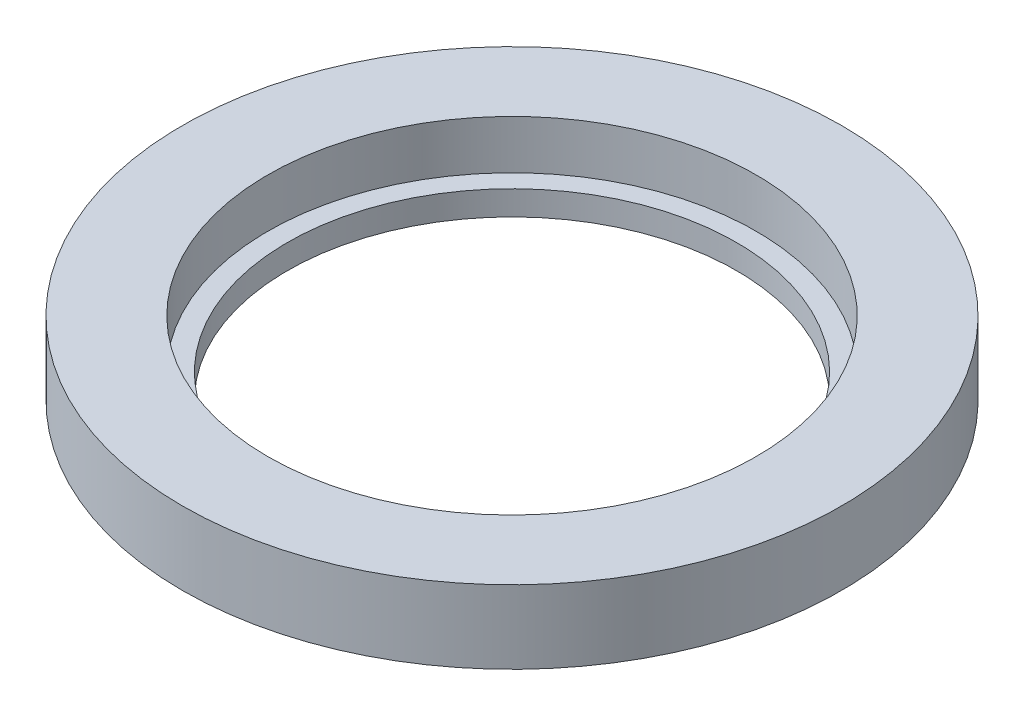
ISO-10303-21;
HEADER;
FILE_DESCRIPTION(('STEP AP214'),'2;1');
FILE_NAME('part.step','',(''),(''),'','','');
FILE_SCHEMA(('AUTOMOTIVE_DESIGN { 1 0 10303 214 1 1 1 1 }'));
ENDSEC;
DATA;
#1=APPLICATION_CONTEXT('core data for automotive mechanical design processes');
#2=APPLICATION_PROTOCOL_DEFINITION('international standard','automotive_design',2000,#1);
#3=PRODUCT_CONTEXT('',#1,'mechanical');
#4=PRODUCT('Part','Part','',(#3));
#5=PRODUCT_RELATED_PRODUCT_CATEGORY('part','',(#4));
#6=PRODUCT_DEFINITION_FORMATION('','',#4);
#7=PRODUCT_DEFINITION_CONTEXT('part definition',#1,'design');
#8=PRODUCT_DEFINITION('design','',#6,#7);
#9=PRODUCT_DEFINITION_SHAPE('','',#8);
#10=(LENGTH_UNIT() NAMED_UNIT(*) SI_UNIT(.MILLI.,.METRE.));
#11=(NAMED_UNIT(*) PLANE_ANGLE_UNIT() SI_UNIT($,.RADIAN.));
#12=(NAMED_UNIT(*) SI_UNIT($,.STERADIAN.) SOLID_ANGLE_UNIT());
#13=UNCERTAINTY_MEASURE_WITH_UNIT(LENGTH_MEASURE(1.E-05),#10,'distance_accuracy_value','');
#14=(GEOMETRIC_REPRESENTATION_CONTEXT(3) GLOBAL_UNCERTAINTY_ASSIGNED_CONTEXT((#13)) GLOBAL_UNIT_ASSIGNED_CONTEXT((#10,
#11,#12)) REPRESENTATION_CONTEXT('',''));
#15=CARTESIAN_POINT('',(0.,0.,0.));
#16=DIRECTION('',(0.,0.,1.));
#17=DIRECTION('',(1.,0.,0.));
#18=AXIS2_PLACEMENT_3D('',#15,#16,#17);
#19=CARTESIAN_POINT('',(0.,0.,0.));
#20=DIRECTION('',(0.,1.,0.));
#21=DIRECTION('',(0.,0.,1.));
#22=AXIS2_PLACEMENT_3D('',#19,#20,#21);
#23=CYLINDRICAL_SURFACE('',#22,23.);
#24=CARTESIAN_POINT('',(0.,0.,0.));
#25=DIRECTION('',(0.,1.,0.));
#26=DIRECTION('',(0.,0.,1.));
#27=AXIS2_PLACEMENT_3D('',#24,#25,#26);
#28=CIRCLE('',#27,23.);
#29=CARTESIAN_POINT('',(0.,0.,23.));
#30=VERTEX_POINT('',#29);
#31=EDGE_CURVE('E59',#30,#30,#28,.T.);
#32=ORIENTED_EDGE('',*,*,#31,.F.);
#33=EDGE_LOOP('',(#32));
#34=FACE_BOUND('',#33,.T.);
#35=CARTESIAN_POINT('',(0.,2.5,0.));
#36=DIRECTION('',(0.,1.,0.));
#37=DIRECTION('',(0.,0.,1.));
#38=AXIS2_PLACEMENT_3D('',#35,#36,#37);
#39=CIRCLE('',#38,23.);
#40=CARTESIAN_POINT('',(0.,2.5,23.));
#41=VERTEX_POINT('',#40);
#42=EDGE_CURVE('E41',#41,#41,#39,.F.);
#43=ORIENTED_EDGE('',*,*,#42,.F.);
#44=EDGE_LOOP('',(#43));
#45=FACE_BOUND('',#44,.T.);
#46=ADVANCED_FACE('F37',(#34,#45),#23,.F.);
#47=CARTESIAN_POINT('',(0.,7.5,0.));
#48=DIRECTION('',(0.,-1.,0.));
#49=DIRECTION('',(0.,0.,-1.));
#50=AXIS2_PLACEMENT_3D('',#47,#48,#49);
#51=CYLINDRICAL_SURFACE('',#50,33.75);
#52=CARTESIAN_POINT('',(0.,7.5,0.));
#53=DIRECTION('',(0.,1.,0.));
#54=DIRECTION('',(0.,0.,1.));
#55=AXIS2_PLACEMENT_3D('',#52,#53,#54);
#56=CIRCLE('',#55,33.75);
#57=CARTESIAN_POINT('',(0.,7.5,33.75));
#58=VERTEX_POINT('',#57);
#59=EDGE_CURVE('E10',#58,#58,#56,.T.);
#60=ORIENTED_EDGE('',*,*,#59,.F.);
#61=EDGE_LOOP('',(#60));
#62=FACE_BOUND('',#61,.T.);
#63=CARTESIAN_POINT('',(0.,0.,0.));
#64=DIRECTION('',(0.,1.,0.));
#65=DIRECTION('',(0.,0.,1.));
#66=AXIS2_PLACEMENT_3D('',#63,#64,#65);
#67=CIRCLE('',#66,33.75);
#68=CARTESIAN_POINT('',(0.,0.,33.75));
#69=VERTEX_POINT('',#68);
#70=EDGE_CURVE('E46',#69,#69,#67,.T.);
#71=ORIENTED_EDGE('',*,*,#70,.T.);
#72=EDGE_LOOP('',(#71));
#73=FACE_BOUND('',#72,.T.);
#74=ADVANCED_FACE('F39',(#62,#73),#51,.T.);
#75=CARTESIAN_POINT('',(0.,7.5,0.));
#76=DIRECTION('',(0.,1.,0.));
#77=DIRECTION('',(0.,0.,1.));
#78=AXIS2_PLACEMENT_3D('',#75,#76,#77);
#79=PLANE('',#78);
#80=CARTESIAN_POINT('',(0.,7.5,0.));
#81=DIRECTION('',(0.,1.,0.));
#82=DIRECTION('',(0.,0.,1.));
#83=AXIS2_PLACEMENT_3D('',#80,#81,#82);
#84=CIRCLE('',#83,25.);
#85=CARTESIAN_POINT('',(0.,7.5,25.));
#86=VERTEX_POINT('',#85);
#87=EDGE_CURVE('E89',#86,#86,#84,.T.);
#88=ORIENTED_EDGE('',*,*,#87,.F.);
#89=EDGE_LOOP('',(#88));
#90=FACE_BOUND('',#89,.T.);
#91=ORIENTED_EDGE('',*,*,#59,.T.);
#92=EDGE_LOOP('',(#91));
#93=FACE_BOUND('',#92,.T.);
#94=ADVANCED_FACE('F110',(#90,#93),#79,.T.);
#95=CARTESIAN_POINT('',(0.,0.,0.));
#96=DIRECTION('',(0.,1.,0.));
#97=DIRECTION('',(0.,0.,1.));
#98=AXIS2_PLACEMENT_3D('',#95,#96,#97);
#99=PLANE('',#98);
#100=ORIENTED_EDGE('',*,*,#31,.T.);
#101=EDGE_LOOP('',(#100));
#102=FACE_BOUND('',#101,.T.);
#103=CARTESIAN_POINT('',(-30.,0.,0.));
#104=DIRECTION('',(0.,-1.,0.));
#105=DIRECTION('',(0.,0.,-1.));
#106=AXIS2_PLACEMENT_3D('',#103,#104,#105);
#107=CIRCLE('',#106,2.6);
#108=CARTESIAN_POINT('',(-30.,0.,-2.6));
#109=VERTEX_POINT('',#108);
#110=EDGE_CURVE('E79',#109,#109,#107,.T.);
#111=ORIENTED_EDGE('',*,*,#110,.F.);
#112=EDGE_LOOP('',(#111));
#113=FACE_BOUND('',#112,.T.);
#114=CARTESIAN_POINT('',(30.,0.,0.));
#115=DIRECTION('',(0.,-1.,0.));
#116=DIRECTION('',(0.,0.,1.));
#117=AXIS2_PLACEMENT_3D('',#114,#115,#116);
#118=CIRCLE('',#117,2.6);
#119=CARTESIAN_POINT('',(30.,0.,2.6));
#120=VERTEX_POINT('',#119);
#121=EDGE_CURVE('E71',#120,#120,#118,.T.);
#122=ORIENTED_EDGE('',*,*,#121,.F.);
#123=EDGE_LOOP('',(#122));
#124=FACE_BOUND('',#123,.T.);
#125=CARTESIAN_POINT('',(0.,0.,-30.));
#126=DIRECTION('',(0.,-1.,0.));
#127=DIRECTION('',(0.,0.,1.));
#128=AXIS2_PLACEMENT_3D('',#125,#126,#127);
#129=CIRCLE('',#128,2.6);
#130=CARTESIAN_POINT('',(0.,0.,-27.4));
#131=VERTEX_POINT('',#130);
#132=EDGE_CURVE('E63',#131,#131,#129,.T.);
#133=ORIENTED_EDGE('',*,*,#132,.F.);
#134=EDGE_LOOP('',(#133));
#135=FACE_BOUND('',#134,.T.);
#136=CARTESIAN_POINT('',(0.,0.,30.));
#137=DIRECTION('',(0.,-1.,0.));
#138=DIRECTION('',(0.,0.,-1.));
#139=AXIS2_PLACEMENT_3D('',#136,#137,#138);
#140=CIRCLE('',#139,2.6);
#141=CARTESIAN_POINT('',(0.,0.,27.4));
#142=VERTEX_POINT('',#141);
#143=EDGE_CURVE('E54',#142,#142,#140,.T.);
#144=ORIENTED_EDGE('',*,*,#143,.F.);
#145=EDGE_LOOP('',(#144));
#146=FACE_BOUND('',#145,.T.);
#147=ORIENTED_EDGE('',*,*,#70,.F.);
#148=EDGE_LOOP('',(#147));
#149=FACE_BOUND('',#148,.T.);
#150=ADVANCED_FACE('F148',(#102,#113,#124,#135,#146,#149),#99,.F.);
#151=CARTESIAN_POINT('',(0.,2.5,30.));
#152=DIRECTION('',(0.,-1.,0.));
#153=DIRECTION('',(0.,0.,-1.));
#154=AXIS2_PLACEMENT_3D('',#151,#152,#153);
#155=CYLINDRICAL_SURFACE('',#154,2.6);
#156=CARTESIAN_POINT('',(0.,2.5,30.));
#157=DIRECTION('',(0.,-1.,0.));
#158=DIRECTION('',(0.,0.,-1.));
#159=AXIS2_PLACEMENT_3D('',#156,#157,#158);
#160=CIRCLE('',#159,2.6);
#161=CARTESIAN_POINT('',(0.,2.5,27.4));
#162=VERTEX_POINT('',#161);
#163=EDGE_CURVE('E58',#162,#162,#160,.T.);
#164=ORIENTED_EDGE('',*,*,#163,.F.);
#165=EDGE_LOOP('',(#164));
#166=FACE_BOUND('',#165,.T.);
#167=ORIENTED_EDGE('',*,*,#143,.T.);
#168=EDGE_LOOP('',(#167));
#169=FACE_BOUND('',#168,.T.);
#170=ADVANCED_FACE('F144',(#166,#169),#155,.F.);
#171=CARTESIAN_POINT('',(0.,2.5,30.));
#172=DIRECTION('',(0.,-1.,0.));
#173=DIRECTION('',(0.,0.,-1.));
#174=AXIS2_PLACEMENT_3D('',#171,#172,#173);
#175=PLANE('',#174);
#176=ORIENTED_EDGE('',*,*,#163,.T.);
#177=EDGE_LOOP('',(#176));
#178=FACE_BOUND('',#177,.T.);
#179=ADVANCED_FACE('F140',(#178),#175,.T.);
#180=CARTESIAN_POINT('',(0.,2.5,-30.));
#181=DIRECTION('',(0.,-1.,0.));
#182=DIRECTION('',(0.,0.,-1.));
#183=AXIS2_PLACEMENT_3D('',#180,#181,#182);
#184=CYLINDRICAL_SURFACE('',#183,2.6);
#185=CARTESIAN_POINT('',(0.,2.5,-30.));
#186=DIRECTION('',(0.,-1.,0.));
#187=DIRECTION('',(0.,0.,1.));
#188=AXIS2_PLACEMENT_3D('',#185,#186,#187);
#189=CIRCLE('',#188,2.6);
#190=CARTESIAN_POINT('',(0.,2.5,-27.4));
#191=VERTEX_POINT('',#190);
#192=EDGE_CURVE('E67',#191,#191,#189,.T.);
#193=ORIENTED_EDGE('',*,*,#192,.F.);
#194=EDGE_LOOP('',(#193));
#195=FACE_BOUND('',#194,.T.);
#196=ORIENTED_EDGE('',*,*,#132,.T.);
#197=EDGE_LOOP('',(#196));
#198=FACE_BOUND('',#197,.T.);
#199=ADVANCED_FACE('F136',(#195,#198),#184,.F.);
#200=CARTESIAN_POINT('',(0.,2.5,-30.));
#201=DIRECTION('',(0.,1.,0.));
#202=DIRECTION('',(0.,0.,1.));
#203=AXIS2_PLACEMENT_3D('',#200,#201,#202);
#204=PLANE('',#203);
#205=ORIENTED_EDGE('',*,*,#192,.T.);
#206=EDGE_LOOP('',(#205));
#207=FACE_BOUND('',#206,.T.);
#208=ADVANCED_FACE('F132',(#207),#204,.F.);
#209=CARTESIAN_POINT('',(30.,2.5,0.));
#210=DIRECTION('',(0.,-1.,0.));
#211=DIRECTION('',(0.,0.,-1.));
#212=AXIS2_PLACEMENT_3D('',#209,#210,#211);
#213=CYLINDRICAL_SURFACE('',#212,2.6);
#214=CARTESIAN_POINT('',(30.,2.5,0.));
#215=DIRECTION('',(0.,-1.,0.));
#216=DIRECTION('',(0.,0.,1.));
#217=AXIS2_PLACEMENT_3D('',#214,#215,#216);
#218=CIRCLE('',#217,2.6);
#219=CARTESIAN_POINT('',(30.,2.5,2.6));
#220=VERTEX_POINT('',#219);
#221=EDGE_CURVE('E75',#220,#220,#218,.T.);
#222=ORIENTED_EDGE('',*,*,#221,.F.);
#223=EDGE_LOOP('',(#222));
#224=FACE_BOUND('',#223,.T.);
#225=ORIENTED_EDGE('',*,*,#121,.T.);
#226=EDGE_LOOP('',(#225));
#227=FACE_BOUND('',#226,.T.);
#228=ADVANCED_FACE('F128',(#224,#227),#213,.F.);
#229=CARTESIAN_POINT('',(30.,2.5,0.));
#230=DIRECTION('',(0.,1.,0.));
#231=DIRECTION('',(0.,0.,1.));
#232=AXIS2_PLACEMENT_3D('',#229,#230,#231);
#233=PLANE('',#232);
#234=ORIENTED_EDGE('',*,*,#221,.T.);
#235=EDGE_LOOP('',(#234));
#236=FACE_BOUND('',#235,.T.);
#237=ADVANCED_FACE('F124',(#236),#233,.F.);
#238=CARTESIAN_POINT('',(-30.,2.5,0.));
#239=DIRECTION('',(0.,-1.,0.));
#240=DIRECTION('',(0.,0.,-1.));
#241=AXIS2_PLACEMENT_3D('',#238,#239,#240);
#242=CYLINDRICAL_SURFACE('',#241,2.6);
#243=CARTESIAN_POINT('',(-30.,2.5,0.));
#244=DIRECTION('',(0.,-1.,0.));
#245=DIRECTION('',(0.,0.,-1.));
#246=AXIS2_PLACEMENT_3D('',#243,#244,#245);
#247=CIRCLE('',#246,2.6);
#248=CARTESIAN_POINT('',(-30.,2.5,-2.6));
#249=VERTEX_POINT('',#248);
#250=EDGE_CURVE('E52',#249,#249,#247,.T.);
#251=ORIENTED_EDGE('',*,*,#250,.F.);
#252=EDGE_LOOP('',(#251));
#253=FACE_BOUND('',#252,.T.);
#254=ORIENTED_EDGE('',*,*,#110,.T.);
#255=EDGE_LOOP('',(#254));
#256=FACE_BOUND('',#255,.T.);
#257=ADVANCED_FACE('F120',(#253,#256),#242,.F.);
#258=CARTESIAN_POINT('',(-30.,2.5,0.));
#259=DIRECTION('',(0.,-1.,0.));
#260=DIRECTION('',(0.,0.,-1.));
#261=AXIS2_PLACEMENT_3D('',#258,#259,#260);
#262=PLANE('',#261);
#263=ORIENTED_EDGE('',*,*,#250,.T.);
#264=EDGE_LOOP('',(#263));
#265=FACE_BOUND('',#264,.T.);
#266=ADVANCED_FACE('F117',(#265),#262,.T.);
#267=CARTESIAN_POINT('',(0.,2.5,0.));
#268=DIRECTION('',(0.,1.,0.));
#269=DIRECTION('',(0.,0.,1.));
#270=AXIS2_PLACEMENT_3D('',#267,#268,#269);
#271=PLANE('',#270);
#272=CARTESIAN_POINT('',(0.,2.5,0.));
#273=DIRECTION('',(0.,1.,0.));
#274=DIRECTION('',(0.,0.,1.));
#275=AXIS2_PLACEMENT_3D('',#272,#273,#274);
#276=CIRCLE('',#275,25.);
#277=CARTESIAN_POINT('',(0.,2.5,25.));
#278=VERTEX_POINT('',#277);
#279=EDGE_CURVE('E93',#278,#278,#276,.T.);
#280=ORIENTED_EDGE('',*,*,#279,.T.);
#281=EDGE_LOOP('',(#280));
#282=FACE_BOUND('',#281,.T.);
#283=ORIENTED_EDGE('',*,*,#42,.T.);
#284=EDGE_LOOP('',(#283));
#285=FACE_BOUND('',#284,.T.);
#286=ADVANCED_FACE('F102',(#282,#285),#271,.T.);
#287=CARTESIAN_POINT('',(0.,2.5,0.));
#288=DIRECTION('',(0.,1.,0.));
#289=DIRECTION('',(0.,0.,1.));
#290=AXIS2_PLACEMENT_3D('',#287,#288,#289);
#291=CYLINDRICAL_SURFACE('',#290,25.);
#292=ORIENTED_EDGE('',*,*,#279,.F.);
#293=EDGE_LOOP('',(#292));
#294=FACE_BOUND('',#293,.T.);
#295=ORIENTED_EDGE('',*,*,#87,.T.);
#296=EDGE_LOOP('',(#295));
#297=FACE_BOUND('',#296,.T.);
#298=ADVANCED_FACE('F115',(#294,#297),#291,.F.);
#299=CLOSED_SHELL('',(#46,#74,#94,#150,#170,#179,#199,#208,#228,#237,#257,#266,#286,#298));
#300=MANIFOLD_SOLID_BREP('B2',#299);
#301=ADVANCED_BREP_SHAPE_REPRESENTATION('',(#18,#300),#14);
#302=SHAPE_DEFINITION_REPRESENTATION(#9,#301);
ENDSEC;
END-ISO-10303-21;
